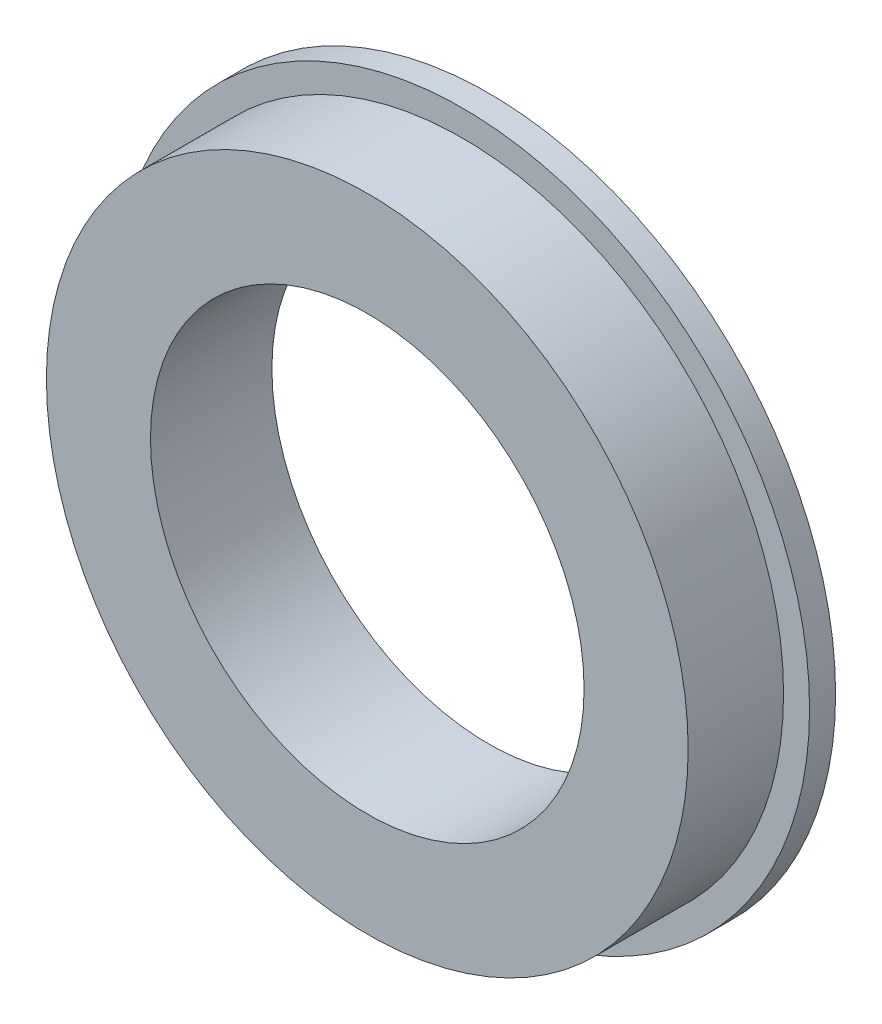
ISO-10303-21;
HEADER;
FILE_DESCRIPTION(('STEP AP214'),'2;1');
FILE_NAME('part.step','',(''),(''),'','','');
FILE_SCHEMA(('AUTOMOTIVE_DESIGN { 1 0 10303 214 1 1 1 1 }'));
ENDSEC;
DATA;
#1=APPLICATION_CONTEXT('core data for automotive mechanical design processes');
#2=APPLICATION_PROTOCOL_DEFINITION('international standard','automotive_design',2000,#1);
#3=PRODUCT_CONTEXT('',#1,'mechanical');
#4=PRODUCT('Part','Part','',(#3));
#5=PRODUCT_RELATED_PRODUCT_CATEGORY('part','',(#4));
#6=PRODUCT_DEFINITION_FORMATION('','',#4);
#7=PRODUCT_DEFINITION_CONTEXT('part definition',#1,'design');
#8=PRODUCT_DEFINITION('design','',#6,#7);
#9=PRODUCT_DEFINITION_SHAPE('','',#8);
#10=(LENGTH_UNIT() NAMED_UNIT(*) SI_UNIT(.MILLI.,.METRE.));
#11=(NAMED_UNIT(*) PLANE_ANGLE_UNIT() SI_UNIT($,.RADIAN.));
#12=(NAMED_UNIT(*) SI_UNIT($,.STERADIAN.) SOLID_ANGLE_UNIT());
#13=UNCERTAINTY_MEASURE_WITH_UNIT(LENGTH_MEASURE(1.E-05),#10,'distance_accuracy_value','');
#14=(GEOMETRIC_REPRESENTATION_CONTEXT(3) GLOBAL_UNCERTAINTY_ASSIGNED_CONTEXT((#13)) GLOBAL_UNIT_ASSIGNED_CONTEXT((#10,
#11,#12)) REPRESENTATION_CONTEXT('',''));
#15=CARTESIAN_POINT('',(0.,0.,0.));
#16=DIRECTION('',(0.,0.,1.));
#17=DIRECTION('',(1.,0.,0.));
#18=AXIS2_PLACEMENT_3D('',#15,#16,#17);
#19=CARTESIAN_POINT('',(0.,0.,1.5));
#20=DIRECTION('',(0.,0.,1.));
#21=DIRECTION('',(1.,0.,0.));
#22=AXIS2_PLACEMENT_3D('',#19,#20,#21);
#23=PLANE('',#22);
#24=CARTESIAN_POINT('',(0.,0.,1.5));
#25=DIRECTION('',(0.,0.,1.));
#26=DIRECTION('',(1.,0.,0.));
#27=AXIS2_PLACEMENT_3D('',#24,#25,#26);
#28=CIRCLE('',#27,18.5);
#29=CARTESIAN_POINT('',(18.5,0.,1.5));
#30=VERTEX_POINT('',#29);
#31=EDGE_CURVE('E10',#30,#30,#28,.T.);
#32=ORIENTED_EDGE('',*,*,#31,.F.);
#33=EDGE_LOOP('',(#32));
#34=FACE_BOUND('',#33,.T.);
#35=CARTESIAN_POINT('',(0.,0.,1.5));
#36=DIRECTION('',(0.,0.,1.));
#37=DIRECTION('',(1.,0.,0.));
#38=AXIS2_PLACEMENT_3D('',#35,#36,#37);
#39=CIRCLE('',#38,20.);
#40=CARTESIAN_POINT('',(20.,0.,1.5));
#41=VERTEX_POINT('',#40);
#42=EDGE_CURVE('E40',#41,#41,#39,.T.);
#43=ORIENTED_EDGE('',*,*,#42,.T.);
#44=EDGE_LOOP('',(#43));
#45=FACE_BOUND('',#44,.T.);
#46=ADVANCED_FACE('F32',(#34,#45),#23,.T.);
#47=CARTESIAN_POINT('',(0.,0.,0.));
#48=DIRECTION('',(0.,0.,1.));
#49=DIRECTION('',(1.,0.,0.));
#50=AXIS2_PLACEMENT_3D('',#47,#48,#49);
#51=PLANE('',#50);
#52=CARTESIAN_POINT('',(0.,0.,0.));
#53=DIRECTION('',(0.,0.,1.));
#54=DIRECTION('',(1.,0.,0.));
#55=AXIS2_PLACEMENT_3D('',#52,#53,#54);
#56=CIRCLE('',#55,20.);
#57=CARTESIAN_POINT('',(20.,0.,0.));
#58=VERTEX_POINT('',#57);
#59=EDGE_CURVE('E36',#58,#58,#56,.T.);
#60=ORIENTED_EDGE('',*,*,#59,.F.);
#61=EDGE_LOOP('',(#60));
#62=FACE_BOUND('',#61,.T.);
#63=CARTESIAN_POINT('',(0.,0.,0.));
#64=DIRECTION('',(0.,0.,1.));
#65=DIRECTION('',(1.,0.,0.));
#66=AXIS2_PLACEMENT_3D('',#63,#64,#65);
#67=CIRCLE('',#66,12.5);
#68=CARTESIAN_POINT('',(12.5,0.,0.));
#69=VERTEX_POINT('',#68);
#70=EDGE_CURVE('E49',#69,#69,#67,.T.);
#71=ORIENTED_EDGE('',*,*,#70,.T.);
#72=EDGE_LOOP('',(#71));
#73=FACE_BOUND('',#72,.T.);
#74=ADVANCED_FACE('F76',(#62,#73),#51,.F.);
#75=CARTESIAN_POINT('',(0.,0.,1.5));
#76=DIRECTION('',(0.,0.,-1.));
#77=DIRECTION('',(-1.,0.,0.));
#78=AXIS2_PLACEMENT_3D('',#75,#76,#77);
#79=CYLINDRICAL_SURFACE('',#78,20.);
#80=ORIENTED_EDGE('',*,*,#42,.F.);
#81=EDGE_LOOP('',(#80));
#82=FACE_BOUND('',#81,.T.);
#83=ORIENTED_EDGE('',*,*,#59,.T.);
#84=EDGE_LOOP('',(#83));
#85=FACE_BOUND('',#84,.T.);
#86=ADVANCED_FACE('F34',(#82,#85),#79,.T.);
#87=CARTESIAN_POINT('',(0.,0.,1.5));
#88=DIRECTION('',(0.,0.,-1.));
#89=DIRECTION('',(-1.,0.,0.));
#90=AXIS2_PLACEMENT_3D('',#87,#88,#89);
#91=CYLINDRICAL_SURFACE('',#90,12.5);
#92=ORIENTED_EDGE('',*,*,#70,.F.);
#93=EDGE_LOOP('',(#92));
#94=FACE_BOUND('',#93,.T.);
#95=CARTESIAN_POINT('',(0.,0.,7.));
#96=DIRECTION('',(0.,0.,1.));
#97=DIRECTION('',(1.,0.,0.));
#98=AXIS2_PLACEMENT_3D('',#95,#96,#97);
#99=CIRCLE('',#98,12.5);
#100=CARTESIAN_POINT('',(12.5,0.,7.));
#101=VERTEX_POINT('',#100);
#102=EDGE_CURVE('E55',#101,#101,#99,.T.);
#103=ORIENTED_EDGE('',*,*,#102,.T.);
#104=EDGE_LOOP('',(#103));
#105=FACE_BOUND('',#104,.T.);
#106=ADVANCED_FACE('F61',(#94,#105),#91,.F.);
#107=CARTESIAN_POINT('',(0.,0.,7.));
#108=DIRECTION('',(0.,0.,1.));
#109=DIRECTION('',(1.,0.,0.));
#110=AXIS2_PLACEMENT_3D('',#107,#108,#109);
#111=PLANE('',#110);
#112=CARTESIAN_POINT('',(0.,0.,7.));
#113=DIRECTION('',(0.,0.,1.));
#114=DIRECTION('',(1.,0.,0.));
#115=AXIS2_PLACEMENT_3D('',#112,#113,#114);
#116=CIRCLE('',#115,18.5);
#117=CARTESIAN_POINT('',(18.5,0.,7.));
#118=VERTEX_POINT('',#117);
#119=EDGE_CURVE('E47',#118,#118,#116,.T.);
#120=ORIENTED_EDGE('',*,*,#119,.T.);
#121=EDGE_LOOP('',(#120));
#122=FACE_BOUND('',#121,.T.);
#123=ORIENTED_EDGE('',*,*,#102,.F.);
#124=EDGE_LOOP('',(#123));
#125=FACE_BOUND('',#124,.T.);
#126=ADVANCED_FACE('F63',(#122,#125),#111,.T.);
#127=CARTESIAN_POINT('',(0.,0.,7.));
#128=DIRECTION('',(0.,0.,-1.));
#129=DIRECTION('',(-1.,0.,0.));
#130=AXIS2_PLACEMENT_3D('',#127,#128,#129);
#131=CYLINDRICAL_SURFACE('',#130,18.5);
#132=ORIENTED_EDGE('',*,*,#119,.F.);
#133=EDGE_LOOP('',(#132));
#134=FACE_BOUND('',#133,.T.);
#135=ORIENTED_EDGE('',*,*,#31,.T.);
#136=EDGE_LOOP('',(#135));
#137=FACE_BOUND('',#136,.T.);
#138=ADVANCED_FACE('F65',(#134,#137),#131,.T.);
#139=CLOSED_SHELL('',(#46,#74,#86,#106,#126,#138));
#140=MANIFOLD_SOLID_BREP('B2',#139);
#141=ADVANCED_BREP_SHAPE_REPRESENTATION('',(#18,#140),#14);
#142=SHAPE_DEFINITION_REPRESENTATION(#9,#141);
ENDSEC;
END-ISO-10303-21;
